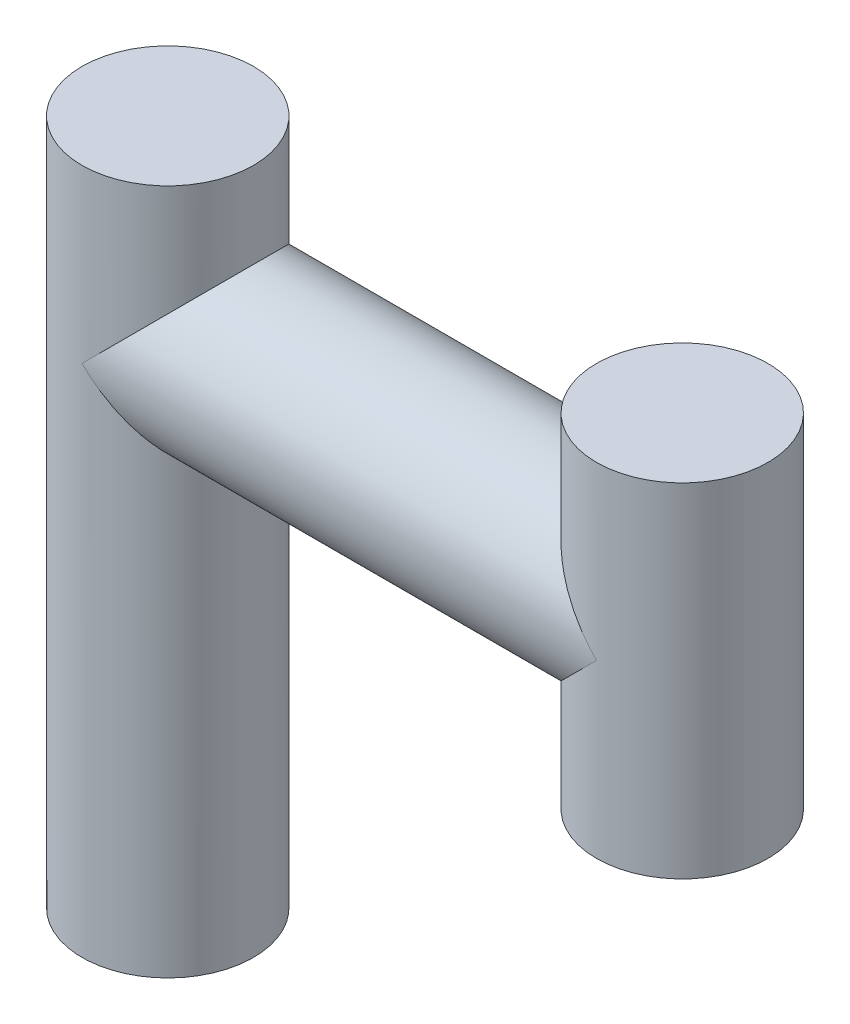
ISO-10303-21;
HEADER;
FILE_DESCRIPTION(('STEP AP214'),'2;1');
FILE_NAME('part.step','',(''),(''),'','','');
FILE_SCHEMA(('AUTOMOTIVE_DESIGN { 1 0 10303 214 1 1 1 1 }'));
ENDSEC;
DATA;
#1=APPLICATION_CONTEXT('core data for automotive mechanical design processes');
#2=APPLICATION_PROTOCOL_DEFINITION('international standard','automotive_design',2000,#1);
#3=PRODUCT_CONTEXT('',#1,'mechanical');
#4=PRODUCT('Part','Part','',(#3));
#5=PRODUCT_RELATED_PRODUCT_CATEGORY('part','',(#4));
#6=PRODUCT_DEFINITION_FORMATION('','',#4);
#7=PRODUCT_DEFINITION_CONTEXT('part definition',#1,'design');
#8=PRODUCT_DEFINITION('design','',#6,#7);
#9=PRODUCT_DEFINITION_SHAPE('','',#8);
#10=(LENGTH_UNIT() NAMED_UNIT(*) SI_UNIT(.MILLI.,.METRE.));
#11=(NAMED_UNIT(*) PLANE_ANGLE_UNIT() SI_UNIT($,.RADIAN.));
#12=(NAMED_UNIT(*) SI_UNIT($,.STERADIAN.) SOLID_ANGLE_UNIT());
#13=UNCERTAINTY_MEASURE_WITH_UNIT(LENGTH_MEASURE(1.E-05),#10,'distance_accuracy_value','');
#14=(GEOMETRIC_REPRESENTATION_CONTEXT(3) GLOBAL_UNCERTAINTY_ASSIGNED_CONTEXT((#13)) GLOBAL_UNIT_ASSIGNED_CONTEXT((#10,
#11,#12)) REPRESENTATION_CONTEXT('',''));
#15=CARTESIAN_POINT('',(0.,0.,0.));
#16=DIRECTION('',(0.,0.,1.));
#17=DIRECTION('',(1.,0.,0.));
#18=AXIS2_PLACEMENT_3D('',#15,#16,#17);
#19=CARTESIAN_POINT('',(0.,10.,0.));
#20=DIRECTION('',(0.,-1.,0.));
#21=DIRECTION('',(0.,0.,-1.));
#22=AXIS2_PLACEMENT_3D('',#19,#20,#21);
#23=CYLINDRICAL_SURFACE('',#22,2.5);
#24=CARTESIAN_POINT('',(0.,10.,0.));
#25=DIRECTION('',(0.,1.,0.));
#26=DIRECTION('',(0.,0.,1.));
#27=AXIS2_PLACEMENT_3D('',#24,#25,#26);
#28=CIRCLE('',#27,2.5);
#29=CARTESIAN_POINT('',(0.,10.,2.5));
#30=VERTEX_POINT('',#29);
#31=EDGE_CURVE('E63',#30,#30,#28,.T.);
#32=ORIENTED_EDGE('',*,*,#31,.F.);
#33=EDGE_LOOP('',(#32));
#34=FACE_BOUND('',#33,.T.);
#35=CARTESIAN_POINT('',(0.,5.,0.));
#36=DIRECTION('',(-0.707106781186547,-0.707106781186547,0.));
#37=DIRECTION('',(0.707106781186547,-0.707106781186547,0.));
#38=AXIS2_PLACEMENT_3D('',#35,#36,#37);
#39=ELLIPSE('',#38,3.53553390593274,2.5);
#40=CARTESIAN_POINT('',(0.,5.,2.5));
#41=VERTEX_POINT('',#40);
#42=CARTESIAN_POINT('',(0.,5.,-2.5));
#43=VERTEX_POINT('',#42);
#44=EDGE_CURVE('E11',#41,#43,#39,.F.);
#45=ORIENTED_EDGE('',*,*,#44,.F.);
#46=CARTESIAN_POINT('',(0.,5.,0.));
#47=DIRECTION('',(0.707106781186547,-0.707106781186547,0.));
#48=DIRECTION('',(-0.707106781186547,-0.707106781186547,0.));
#49=AXIS2_PLACEMENT_3D('',#46,#47,#48);
#50=ELLIPSE('',#49,3.53553390593274,2.5);
#51=EDGE_CURVE('E41',#43,#41,#50,.T.);
#52=ORIENTED_EDGE('',*,*,#51,.F.);
#53=EDGE_LOOP('',(#45,#52));
#54=FACE_BOUND('',#53,.T.);
#55=CARTESIAN_POINT('',(0.,-10.,0.));
#56=DIRECTION('',(0.,-1.,0.));
#57=DIRECTION('',(0.,0.,-1.));
#58=AXIS2_PLACEMENT_3D('',#55,#56,#57);
#59=CIRCLE('',#58,2.5);
#60=CARTESIAN_POINT('',(0.,-10.,-2.5));
#61=VERTEX_POINT('',#60);
#62=EDGE_CURVE('E88',#61,#61,#59,.T.);
#63=ORIENTED_EDGE('',*,*,#62,.F.);
#64=EDGE_LOOP('',(#63));
#65=FACE_BOUND('',#64,.T.);
#66=ADVANCED_FACE('F34',(#34,#54,#65),#23,.T.);
#67=CARTESIAN_POINT('',(0.,10.,0.));
#68=DIRECTION('',(0.,1.,0.));
#69=DIRECTION('',(0.,0.,1.));
#70=AXIS2_PLACEMENT_3D('',#67,#68,#69);
#71=PLANE('',#70);
#72=ORIENTED_EDGE('',*,*,#31,.T.);
#73=EDGE_LOOP('',(#72));
#74=FACE_BOUND('',#73,.T.);
#75=ADVANCED_FACE('F70',(#74),#71,.T.);
#76=CARTESIAN_POINT('',(7.5,5.,0.));
#77=DIRECTION('',(-1.,0.,0.));
#78=DIRECTION('',(0.,0.,1.));
#79=AXIS2_PLACEMENT_3D('',#76,#77,#78);
#80=CYLINDRICAL_SURFACE('',#79,2.5);
#81=ORIENTED_EDGE('',*,*,#51,.T.);
#82=ORIENTED_EDGE('',*,*,#44,.T.);
#83=EDGE_LOOP('',(#81,#82));
#84=FACE_BOUND('',#83,.T.);
#85=CARTESIAN_POINT('',(15.,5.,0.));
#86=DIRECTION('',(0.707106781186547,0.707106781186547,0.));
#87=DIRECTION('',(0.707106781186547,-0.707106781186547,0.));
#88=AXIS2_PLACEMENT_3D('',#85,#86,#87);
#89=ELLIPSE('',#88,3.53553390593274,2.5);
#90=CARTESIAN_POINT('',(15.,5.,-2.5));
#91=VERTEX_POINT('',#90);
#92=CARTESIAN_POINT('',(15.,5.,2.5));
#93=VERTEX_POINT('',#92);
#94=EDGE_CURVE('E55',#91,#93,#89,.T.);
#95=ORIENTED_EDGE('',*,*,#94,.F.);
#96=CARTESIAN_POINT('',(15.,5.,0.));
#97=DIRECTION('',(-0.707106781186547,0.707106781186547,0.));
#98=DIRECTION('',(-0.707106781186547,-0.707106781186547,0.));
#99=AXIS2_PLACEMENT_3D('',#96,#97,#98);
#100=ELLIPSE('',#99,3.53553390593274,2.5);
#101=EDGE_CURVE('E58',#93,#91,#100,.F.);
#102=ORIENTED_EDGE('',*,*,#101,.F.);
#103=EDGE_LOOP('',(#95,#102));
#104=FACE_BOUND('',#103,.T.);
#105=ADVANCED_FACE('F62',(#84,#104),#80,.T.);
#106=CARTESIAN_POINT('',(15.,10.,0.));
#107=DIRECTION('',(0.,-1.,0.));
#108=DIRECTION('',(0.,0.,-1.));
#109=AXIS2_PLACEMENT_3D('',#106,#107,#108);
#110=CYLINDRICAL_SURFACE('',#109,2.5);
#111=CARTESIAN_POINT('',(15.,0.,0.));
#112=DIRECTION('',(0.,-1.,0.));
#113=DIRECTION('',(0.,0.,1.));
#114=AXIS2_PLACEMENT_3D('',#111,#112,#113);
#115=CIRCLE('',#114,2.5);
#116=CARTESIAN_POINT('',(15.,0.,2.5));
#117=VERTEX_POINT('',#116);
#118=EDGE_CURVE('E90',#117,#117,#115,.T.);
#119=ORIENTED_EDGE('',*,*,#118,.F.);
#120=EDGE_LOOP('',(#119));
#121=FACE_BOUND('',#120,.T.);
#122=CARTESIAN_POINT('',(15.,10.,0.));
#123=DIRECTION('',(0.,-1.,0.));
#124=DIRECTION('',(0.,0.,1.));
#125=AXIS2_PLACEMENT_3D('',#122,#123,#124);
#126=CIRCLE('',#125,2.5);
#127=CARTESIAN_POINT('',(15.,10.,2.5));
#128=VERTEX_POINT('',#127);
#129=EDGE_CURVE('E60',#128,#128,#126,.T.);
#130=ORIENTED_EDGE('',*,*,#129,.T.);
#131=EDGE_LOOP('',(#130));
#132=FACE_BOUND('',#131,.T.);
#133=ORIENTED_EDGE('',*,*,#101,.T.);
#134=ORIENTED_EDGE('',*,*,#94,.T.);
#135=EDGE_LOOP('',(#133,#134));
#136=FACE_BOUND('',#135,.T.);
#137=ADVANCED_FACE('F57',(#121,#132,#136),#110,.T.);
#138=CARTESIAN_POINT('',(15.,10.,0.));
#139=DIRECTION('',(0.,1.,0.));
#140=DIRECTION('',(0.,0.,1.));
#141=AXIS2_PLACEMENT_3D('',#138,#139,#140);
#142=PLANE('',#141);
#143=ORIENTED_EDGE('',*,*,#129,.F.);
#144=EDGE_LOOP('',(#143));
#145=FACE_BOUND('',#144,.T.);
#146=ADVANCED_FACE('F76',(#145),#142,.T.);
#147=CARTESIAN_POINT('',(15.,0.,0.));
#148=DIRECTION('',(0.,1.,0.));
#149=DIRECTION('',(0.,0.,1.));
#150=AXIS2_PLACEMENT_3D('',#147,#148,#149);
#151=PLANE('',#150);
#152=ORIENTED_EDGE('',*,*,#118,.T.);
#153=EDGE_LOOP('',(#152));
#154=FACE_BOUND('',#153,.T.);
#155=ADVANCED_FACE('F99',(#154),#151,.F.);
#156=CARTESIAN_POINT('',(0.,-10.,0.));
#157=DIRECTION('',(0.,-1.,0.));
#158=DIRECTION('',(0.,0.,-1.));
#159=AXIS2_PLACEMENT_3D('',#156,#157,#158);
#160=PLANE('',#159);
#161=ORIENTED_EDGE('',*,*,#62,.T.);
#162=EDGE_LOOP('',(#161));
#163=FACE_BOUND('',#162,.T.);
#164=ADVANCED_FACE('F104',(#163),#160,.T.);
#165=CLOSED_SHELL('',(#66,#75,#105,#137,#146,#155,#164));
#166=MANIFOLD_SOLID_BREP('B2',#165);
#167=ADVANCED_BREP_SHAPE_REPRESENTATION('',(#18,#166),#14);
#168=SHAPE_DEFINITION_REPRESENTATION(#9,#167);
ENDSEC;
END-ISO-10303-21;
